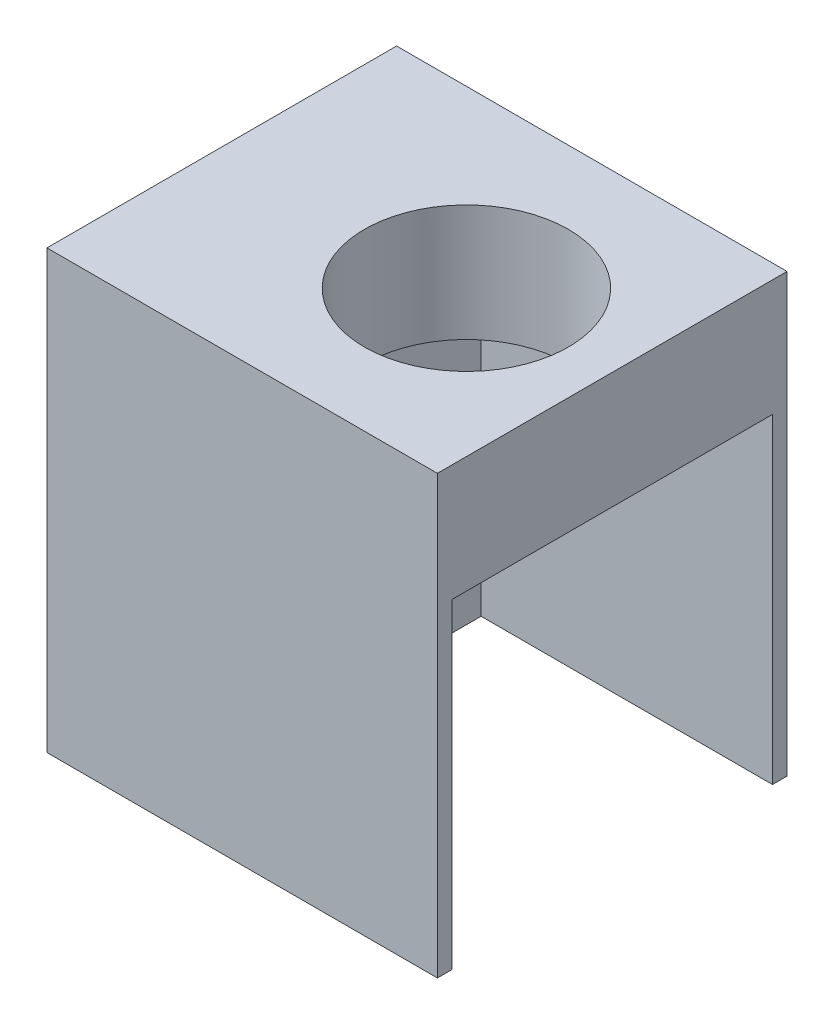
ISO-10303-21;
HEADER;
FILE_DESCRIPTION(('STEP AP214'),'2;1');
FILE_NAME('part.step','',(''),(''),'','','');
FILE_SCHEMA(('AUTOMOTIVE_DESIGN { 1 0 10303 214 1 1 1 1 }'));
ENDSEC;
DATA;
#1=APPLICATION_CONTEXT('core data for automotive mechanical design processes');
#2=APPLICATION_PROTOCOL_DEFINITION('international standard','automotive_design',2000,#1);
#3=PRODUCT_CONTEXT('',#1,'mechanical');
#4=PRODUCT('Part','Part','',(#3));
#5=PRODUCT_RELATED_PRODUCT_CATEGORY('part','',(#4));
#6=PRODUCT_DEFINITION_FORMATION('','',#4);
#7=PRODUCT_DEFINITION_CONTEXT('part definition',#1,'design');
#8=PRODUCT_DEFINITION('design','',#6,#7);
#9=PRODUCT_DEFINITION_SHAPE('','',#8);
#10=(LENGTH_UNIT() NAMED_UNIT(*) SI_UNIT(.MILLI.,.METRE.));
#11=(NAMED_UNIT(*) PLANE_ANGLE_UNIT() SI_UNIT($,.RADIAN.));
#12=(NAMED_UNIT(*) SI_UNIT($,.STERADIAN.) SOLID_ANGLE_UNIT());
#13=UNCERTAINTY_MEASURE_WITH_UNIT(LENGTH_MEASURE(1.E-05),#10,'distance_accuracy_value','');
#14=(GEOMETRIC_REPRESENTATION_CONTEXT(3) GLOBAL_UNCERTAINTY_ASSIGNED_CONTEXT((#13)) GLOBAL_UNIT_ASSIGNED_CONTEXT((#10,
#11,#12)) REPRESENTATION_CONTEXT('',''));
#15=CARTESIAN_POINT('',(0.,0.,0.));
#16=DIRECTION('',(0.,0.,1.));
#17=DIRECTION('',(1.,0.,0.));
#18=AXIS2_PLACEMENT_3D('',#15,#16,#17);
#19=CARTESIAN_POINT('',(8.39574005872127,15.,6.));
#20=DIRECTION('',(0.,-1.,0.));
#21=DIRECTION('',(0.,0.,-1.));
#22=AXIS2_PLACEMENT_3D('',#19,#20,#21);
#23=CYLINDRICAL_SURFACE('',#22,3.5);
#24=CARTESIAN_POINT('',(8.39574005872127,15.,6.));
#25=DIRECTION('',(0.,1.,0.));
#26=DIRECTION('',(0.,0.,1.));
#27=AXIS2_PLACEMENT_3D('',#24,#25,#26);
#28=CIRCLE('',#27,3.5);
#29=CARTESIAN_POINT('',(8.39574005872127,15.,9.5));
#30=VERTEX_POINT('',#29);
#31=EDGE_CURVE('E149',#30,#30,#28,.T.);
#32=ORIENTED_EDGE('',*,*,#31,.T.);
#33=EDGE_LOOP('',(#32));
#34=FACE_BOUND('',#33,.T.);
#35=CARTESIAN_POINT('',(8.39574005872127,11.,6.));
#36=DIRECTION('',(0.,-1.,0.));
#37=DIRECTION('',(0.,0.,-1.));
#38=AXIS2_PLACEMENT_3D('',#35,#36,#37);
#39=CIRCLE('',#38,3.5);
#40=CARTESIAN_POINT('',(8.39574005872127,11.,2.5));
#41=VERTEX_POINT('',#40);
#42=EDGE_CURVE('E56',#41,#41,#39,.T.);
#43=ORIENTED_EDGE('',*,*,#42,.T.);
#44=EDGE_LOOP('',(#43));
#45=FACE_BOUND('',#44,.T.);
#46=ADVANCED_FACE('F52',(#34,#45),#23,.F.);
#47=CARTESIAN_POINT('',(0.,15.,0.));
#48=DIRECTION('',(0.,-1.,0.));
#49=DIRECTION('',(0.,0.,-1.));
#50=AXIS2_PLACEMENT_3D('',#47,#48,#49);
#51=PLANE('',#50);
#52=DIRECTION('',(0.,0.,1.));
#53=VECTOR('',#52,1.);
#54=CARTESIAN_POINT('',(13.4,15.,0.));
#55=LINE('',#54,#53);
#56=CARTESIAN_POINT('',(13.4,15.,0.));
#57=VERTEX_POINT('',#56);
#58=CARTESIAN_POINT('',(13.4,15.,12.));
#59=VERTEX_POINT('',#58);
#60=EDGE_CURVE('E164',#57,#59,#55,.T.);
#61=ORIENTED_EDGE('',*,*,#60,.F.);
#62=DIRECTION('',(-1.,0.,0.));
#63=VECTOR('',#62,1.);
#64=CARTESIAN_POINT('',(13.4,15.,0.));
#65=LINE('',#64,#63);
#66=CARTESIAN_POINT('',(0.,15.,0.));
#67=VERTEX_POINT('',#66);
#68=EDGE_CURVE('E157',#57,#67,#65,.T.);
#69=ORIENTED_EDGE('',*,*,#68,.T.);
#70=DIRECTION('',(0.,0.,1.));
#71=VECTOR('',#70,1.);
#72=CARTESIAN_POINT('',(0.,15.,0.));
#73=LINE('',#72,#71);
#74=CARTESIAN_POINT('',(0.,15.,12.));
#75=VERTEX_POINT('',#74);
#76=EDGE_CURVE('E169',#67,#75,#73,.T.);
#77=ORIENTED_EDGE('',*,*,#76,.T.);
#78=DIRECTION('',(-1.,0.,0.));
#79=VECTOR('',#78,1.);
#80=CARTESIAN_POINT('',(13.4,15.,12.));
#81=LINE('',#80,#79);
#82=EDGE_CURVE('E173',#59,#75,#81,.T.);
#83=ORIENTED_EDGE('',*,*,#82,.F.);
#84=EDGE_LOOP('',(#61,#69,#77,#83));
#85=FACE_BOUND('',#84,.T.);
#86=ORIENTED_EDGE('',*,*,#31,.F.);
#87=EDGE_LOOP('',(#86));
#88=FACE_BOUND('',#87,.T.);
#89=ADVANCED_FACE('F202',(#85,#88),#51,.F.);
#90=CARTESIAN_POINT('',(0.,0.,0.));
#91=DIRECTION('',(0.,-1.,0.));
#92=DIRECTION('',(0.,0.,-1.));
#93=AXIS2_PLACEMENT_3D('',#90,#91,#92);
#94=PLANE('',#93);
#95=DIRECTION('',(1.,0.,0.));
#96=VECTOR('',#95,1.);
#97=CARTESIAN_POINT('',(13.4,0.,0.500000000000002));
#98=LINE('',#97,#96);
#99=CARTESIAN_POINT('',(3.4,0.,0.500000000000002));
#100=VERTEX_POINT('',#99);
#101=CARTESIAN_POINT('',(13.4,0.,0.500000000000002));
#102=VERTEX_POINT('',#101);
#103=EDGE_CURVE('E138',#100,#102,#98,.T.);
#104=ORIENTED_EDGE('',*,*,#103,.F.);
#105=DIRECTION('',(0.,0.,-1.));
#106=VECTOR('',#105,1.);
#107=CARTESIAN_POINT('',(3.4,0.,11.5));
#108=LINE('',#107,#106);
#109=CARTESIAN_POINT('',(3.4,0.,11.5));
#110=VERTEX_POINT('',#109);
#111=EDGE_CURVE('E146',#110,#100,#108,.T.);
#112=ORIENTED_EDGE('',*,*,#111,.F.);
#113=DIRECTION('',(-1.,0.,0.));
#114=VECTOR('',#113,1.);
#115=CARTESIAN_POINT('',(13.4,0.,11.5));
#116=LINE('',#115,#114);
#117=CARTESIAN_POINT('',(13.4,0.,11.5));
#118=VERTEX_POINT('',#117);
#119=EDGE_CURVE('E130',#118,#110,#116,.T.);
#120=ORIENTED_EDGE('',*,*,#119,.F.);
#121=DIRECTION('',(0.,0.,1.));
#122=VECTOR('',#121,1.);
#123=CARTESIAN_POINT('',(13.4,0.,0.));
#124=LINE('',#123,#122);
#125=CARTESIAN_POINT('',(13.4,0.,12.));
#126=VERTEX_POINT('',#125);
#127=EDGE_CURVE('E144',#118,#126,#124,.T.);
#128=ORIENTED_EDGE('',*,*,#127,.T.);
#129=DIRECTION('',(-1.,0.,0.));
#130=VECTOR('',#129,1.);
#131=CARTESIAN_POINT('',(13.4,0.,12.));
#132=LINE('',#131,#130);
#133=CARTESIAN_POINT('',(0.,0.,12.));
#134=VERTEX_POINT('',#133);
#135=EDGE_CURVE('E152',#126,#134,#132,.T.);
#136=ORIENTED_EDGE('',*,*,#135,.T.);
#137=DIRECTION('',(0.,0.,1.));
#138=VECTOR('',#137,1.);
#139=CARTESIAN_POINT('',(0.,0.,0.));
#140=LINE('',#139,#138);
#141=CARTESIAN_POINT('',(0.,0.,0.));
#142=VERTEX_POINT('',#141);
#143=EDGE_CURVE('E160',#142,#134,#140,.T.);
#144=ORIENTED_EDGE('',*,*,#143,.F.);
#145=DIRECTION('',(-1.,0.,0.));
#146=VECTOR('',#145,1.);
#147=CARTESIAN_POINT('',(13.4,0.,0.));
#148=LINE('',#147,#146);
#149=CARTESIAN_POINT('',(13.4,0.,0.));
#150=VERTEX_POINT('',#149);
#151=EDGE_CURVE('E163',#150,#142,#148,.T.);
#152=ORIENTED_EDGE('',*,*,#151,.F.);
#153=EDGE_CURVE('E148',#150,#102,#124,.T.);
#154=ORIENTED_EDGE('',*,*,#153,.T.);
#155=EDGE_LOOP('',(#104,#112,#120,#128,#136,#144,#152,#154));
#156=FACE_BOUND('',#155,.T.);
#157=ADVANCED_FACE('F142',(#156),#94,.T.);
#158=CARTESIAN_POINT('',(13.4,15.,0.));
#159=DIRECTION('',(1.,0.,0.));
#160=DIRECTION('',(0.,0.,-1.));
#161=AXIS2_PLACEMENT_3D('',#158,#159,#160);
#162=PLANE('',#161);
#163=DIRECTION('',(0.,-1.,0.));
#164=VECTOR('',#163,1.);
#165=CARTESIAN_POINT('',(13.4,29.8660687473185,0.500000000000002));
#166=LINE('',#165,#164);
#167=CARTESIAN_POINT('',(13.4,11.,0.500000000000002));
#168=VERTEX_POINT('',#167);
#169=EDGE_CURVE('E69',#168,#102,#166,.T.);
#170=ORIENTED_EDGE('',*,*,#169,.T.);
#171=ORIENTED_EDGE('',*,*,#153,.F.);
#172=DIRECTION('',(0.,-1.,0.));
#173=VECTOR('',#172,1.);
#174=CARTESIAN_POINT('',(13.4,15.,0.));
#175=LINE('',#174,#173);
#176=EDGE_CURVE('E13',#57,#150,#175,.T.);
#177=ORIENTED_EDGE('',*,*,#176,.F.);
#178=ORIENTED_EDGE('',*,*,#60,.T.);
#179=DIRECTION('',(0.,-1.,0.));
#180=VECTOR('',#179,1.);
#181=CARTESIAN_POINT('',(13.4,15.,12.));
#182=LINE('',#181,#180);
#183=EDGE_CURVE('E102',#59,#126,#182,.T.);
#184=ORIENTED_EDGE('',*,*,#183,.T.);
#185=ORIENTED_EDGE('',*,*,#127,.F.);
#186=DIRECTION('',(0.,-1.,0.));
#187=VECTOR('',#186,1.);
#188=CARTESIAN_POINT('',(13.4,29.8660687473185,11.5));
#189=LINE('',#188,#187);
#190=CARTESIAN_POINT('',(13.4,11.,11.5));
#191=VERTEX_POINT('',#190);
#192=EDGE_CURVE('E126',#191,#118,#189,.T.);
#193=ORIENTED_EDGE('',*,*,#192,.F.);
#194=DIRECTION('',(0.,0.,-1.));
#195=VECTOR('',#194,1.);
#196=CARTESIAN_POINT('',(13.4,11.,11.5));
#197=LINE('',#196,#195);
#198=EDGE_CURVE('E179',#191,#168,#197,.T.);
#199=ORIENTED_EDGE('',*,*,#198,.T.);
#200=EDGE_LOOP('',(#170,#171,#177,#178,#184,#185,#193,#199));
#201=FACE_BOUND('',#200,.T.);
#202=ADVANCED_FACE('F54',(#201),#162,.T.);
#203=CARTESIAN_POINT('',(13.4,15.,0.));
#204=DIRECTION('',(0.,0.,1.));
#205=DIRECTION('',(1.,0.,0.));
#206=AXIS2_PLACEMENT_3D('',#203,#204,#205);
#207=PLANE('',#206);
#208=ORIENTED_EDGE('',*,*,#151,.T.);
#209=DIRECTION('',(0.,-1.,0.));
#210=VECTOR('',#209,1.);
#211=CARTESIAN_POINT('',(0.,15.,0.));
#212=LINE('',#211,#210);
#213=EDGE_CURVE('E61',#67,#142,#212,.T.);
#214=ORIENTED_EDGE('',*,*,#213,.F.);
#215=ORIENTED_EDGE('',*,*,#68,.F.);
#216=ORIENTED_EDGE('',*,*,#176,.T.);
#217=EDGE_LOOP('',(#208,#214,#215,#216));
#218=FACE_BOUND('',#217,.T.);
#219=ADVANCED_FACE('F198',(#218),#207,.F.);
#220=CARTESIAN_POINT('',(0.,15.,0.));
#221=DIRECTION('',(1.,0.,0.));
#222=DIRECTION('',(0.,0.,-1.));
#223=AXIS2_PLACEMENT_3D('',#220,#221,#222);
#224=PLANE('',#223);
#225=ORIENTED_EDGE('',*,*,#143,.T.);
#226=DIRECTION('',(0.,-1.,0.));
#227=VECTOR('',#226,1.);
#228=CARTESIAN_POINT('',(0.,15.,12.));
#229=LINE('',#228,#227);
#230=EDGE_CURVE('E168',#75,#134,#229,.T.);
#231=ORIENTED_EDGE('',*,*,#230,.F.);
#232=ORIENTED_EDGE('',*,*,#76,.F.);
#233=ORIENTED_EDGE('',*,*,#213,.T.);
#234=EDGE_LOOP('',(#225,#231,#232,#233));
#235=FACE_BOUND('',#234,.T.);
#236=ADVANCED_FACE('F200',(#235),#224,.F.);
#237=CARTESIAN_POINT('',(13.4,15.,12.));
#238=DIRECTION('',(0.,0.,1.));
#239=DIRECTION('',(1.,0.,0.));
#240=AXIS2_PLACEMENT_3D('',#237,#238,#239);
#241=PLANE('',#240);
#242=ORIENTED_EDGE('',*,*,#135,.F.);
#243=ORIENTED_EDGE('',*,*,#183,.F.);
#244=ORIENTED_EDGE('',*,*,#82,.T.);
#245=ORIENTED_EDGE('',*,*,#230,.T.);
#246=EDGE_LOOP('',(#242,#243,#244,#245));
#247=FACE_BOUND('',#246,.T.);
#248=ADVANCED_FACE('F201',(#247),#241,.T.);
#249=CARTESIAN_POINT('',(13.4,29.8660687473185,0.500000000000002));
#250=DIRECTION('',(0.,0.,-1.));
#251=DIRECTION('',(-1.,0.,0.));
#252=AXIS2_PLACEMENT_3D('',#249,#250,#251);
#253=PLANE('',#252);
#254=DIRECTION('',(-1.,0.,0.));
#255=VECTOR('',#254,1.);
#256=CARTESIAN_POINT('',(13.4,11.,0.500000000000002));
#257=LINE('',#256,#255);
#258=CARTESIAN_POINT('',(3.4,11.,0.500000000000002));
#259=VERTEX_POINT('',#258);
#260=EDGE_CURVE('E189',#168,#259,#257,.T.);
#261=ORIENTED_EDGE('',*,*,#260,.T.);
#262=DIRECTION('',(0.,-1.,0.));
#263=VECTOR('',#262,1.);
#264=CARTESIAN_POINT('',(3.4,29.8660687473185,0.500000000000002));
#265=LINE('',#264,#263);
#266=EDGE_CURVE('E182',#259,#100,#265,.T.);
#267=ORIENTED_EDGE('',*,*,#266,.T.);
#268=ORIENTED_EDGE('',*,*,#103,.T.);
#269=ORIENTED_EDGE('',*,*,#169,.F.);
#270=EDGE_LOOP('',(#261,#267,#268,#269));
#271=FACE_BOUND('',#270,.T.);
#272=ADVANCED_FACE('F221',(#271),#253,.F.);
#273=CARTESIAN_POINT('',(3.4,29.8660687473185,11.5));
#274=DIRECTION('',(-1.,0.,0.));
#275=DIRECTION('',(0.,0.,1.));
#276=AXIS2_PLACEMENT_3D('',#273,#274,#275);
#277=PLANE('',#276);
#278=DIRECTION('',(0.,0.,1.));
#279=VECTOR('',#278,1.);
#280=CARTESIAN_POINT('',(3.4,11.,11.5));
#281=LINE('',#280,#279);
#282=CARTESIAN_POINT('',(3.4,11.,11.5));
#283=VERTEX_POINT('',#282);
#284=EDGE_CURVE('E185',#259,#283,#281,.T.);
#285=ORIENTED_EDGE('',*,*,#284,.T.);
#286=DIRECTION('',(0.,-1.,0.));
#287=VECTOR('',#286,1.);
#288=CARTESIAN_POINT('',(3.4,29.8660687473185,11.5));
#289=LINE('',#288,#287);
#290=EDGE_CURVE('E137',#283,#110,#289,.T.);
#291=ORIENTED_EDGE('',*,*,#290,.T.);
#292=ORIENTED_EDGE('',*,*,#111,.T.);
#293=ORIENTED_EDGE('',*,*,#266,.F.);
#294=EDGE_LOOP('',(#285,#291,#292,#293));
#295=FACE_BOUND('',#294,.T.);
#296=ADVANCED_FACE('F194',(#295),#277,.F.);
#297=CARTESIAN_POINT('',(13.4,29.8660687473185,11.5));
#298=DIRECTION('',(0.,0.,1.));
#299=DIRECTION('',(1.,0.,0.));
#300=AXIS2_PLACEMENT_3D('',#297,#298,#299);
#301=PLANE('',#300);
#302=DIRECTION('',(1.,0.,0.));
#303=VECTOR('',#302,1.);
#304=CARTESIAN_POINT('',(13.4,11.,11.5));
#305=LINE('',#304,#303);
#306=EDGE_CURVE('E133',#283,#191,#305,.T.);
#307=ORIENTED_EDGE('',*,*,#306,.T.);
#308=ORIENTED_EDGE('',*,*,#192,.T.);
#309=ORIENTED_EDGE('',*,*,#119,.T.);
#310=ORIENTED_EDGE('',*,*,#290,.F.);
#311=EDGE_LOOP('',(#307,#308,#309,#310));
#312=FACE_BOUND('',#311,.T.);
#313=ADVANCED_FACE('F128',(#312),#301,.F.);
#314=CARTESIAN_POINT('',(0.,11.,0.));
#315=DIRECTION('',(0.,-1.,0.));
#316=DIRECTION('',(0.,0.,-1.));
#317=AXIS2_PLACEMENT_3D('',#314,#315,#316);
#318=PLANE('',#317);
#319=ORIENTED_EDGE('',*,*,#42,.F.);
#320=EDGE_LOOP('',(#319));
#321=FACE_BOUND('',#320,.T.);
#322=ORIENTED_EDGE('',*,*,#198,.F.);
#323=ORIENTED_EDGE('',*,*,#306,.F.);
#324=ORIENTED_EDGE('',*,*,#284,.F.);
#325=ORIENTED_EDGE('',*,*,#260,.F.);
#326=EDGE_LOOP('',(#322,#323,#324,#325));
#327=FACE_BOUND('',#326,.T.);
#328=ADVANCED_FACE('F196',(#321,#327),#318,.T.);
#329=CLOSED_SHELL('',(#46,#89,#157,#202,#219,#236,#248,#272,#296,#313,#328));
#330=MANIFOLD_SOLID_BREP('B2',#329);
#331=ADVANCED_BREP_SHAPE_REPRESENTATION('',(#18,#330),#14);
#332=SHAPE_DEFINITION_REPRESENTATION(#9,#331);
ENDSEC;
END-ISO-10303-21;
